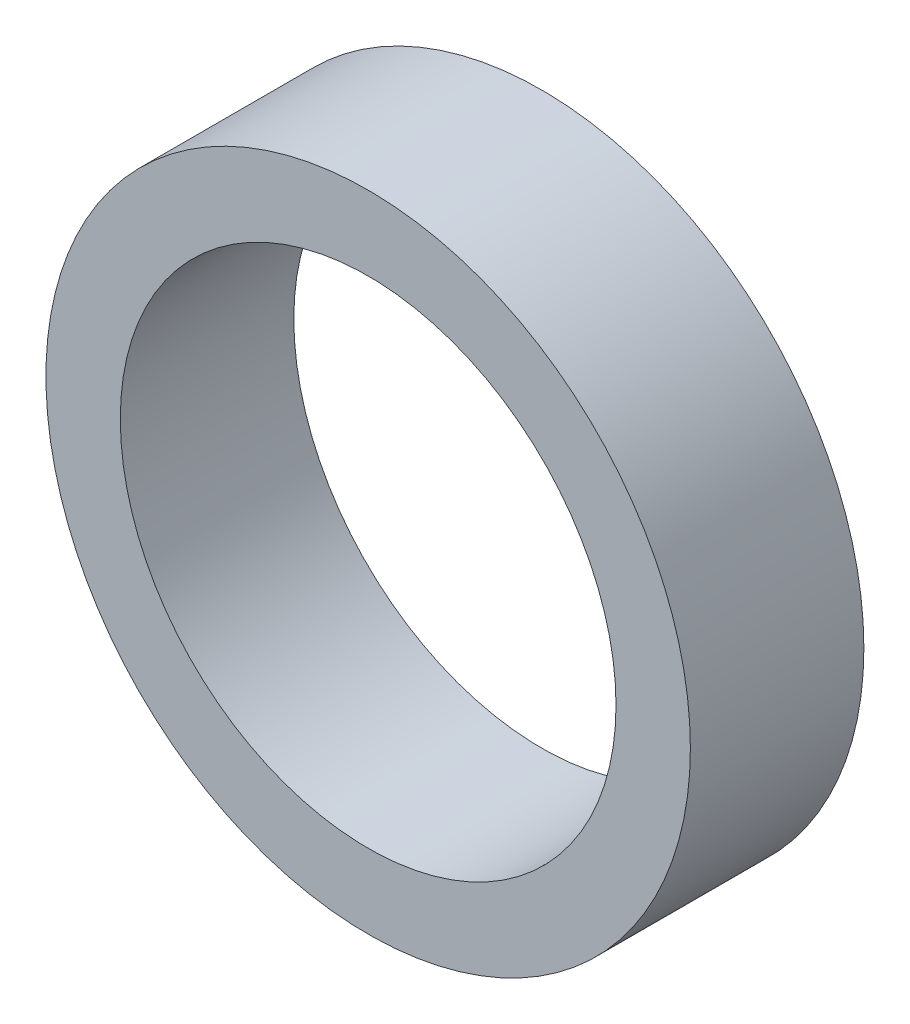
ISO-10303-21;
HEADER;
FILE_DESCRIPTION(('STEP AP214'),'2;1');
FILE_NAME('part.step','',(''),(''),'','','');
FILE_SCHEMA(('AUTOMOTIVE_DESIGN { 1 0 10303 214 1 1 1 1 }'));
ENDSEC;
DATA;
#1=APPLICATION_CONTEXT('core data for automotive mechanical design processes');
#2=APPLICATION_PROTOCOL_DEFINITION('international standard','automotive_design',2000,#1);
#3=PRODUCT_CONTEXT('',#1,'mechanical');
#4=PRODUCT('Part','Part','',(#3));
#5=PRODUCT_RELATED_PRODUCT_CATEGORY('part','',(#4));
#6=PRODUCT_DEFINITION_FORMATION('','',#4);
#7=PRODUCT_DEFINITION_CONTEXT('part definition',#1,'design');
#8=PRODUCT_DEFINITION('design','',#6,#7);
#9=PRODUCT_DEFINITION_SHAPE('','',#8);
#10=(LENGTH_UNIT() NAMED_UNIT(*) SI_UNIT(.MILLI.,.METRE.));
#11=(NAMED_UNIT(*) PLANE_ANGLE_UNIT() SI_UNIT($,.RADIAN.));
#12=(NAMED_UNIT(*) SI_UNIT($,.STERADIAN.) SOLID_ANGLE_UNIT());
#13=UNCERTAINTY_MEASURE_WITH_UNIT(LENGTH_MEASURE(1.E-05),#10,'distance_accuracy_value','');
#14=(GEOMETRIC_REPRESENTATION_CONTEXT(3) GLOBAL_UNCERTAINTY_ASSIGNED_CONTEXT((#13)) GLOBAL_UNIT_ASSIGNED_CONTEXT((#10,
#11,#12)) REPRESENTATION_CONTEXT('',''));
#15=CARTESIAN_POINT('',(0.,0.,0.));
#16=DIRECTION('',(0.,0.,1.));
#17=DIRECTION('',(1.,0.,0.));
#18=AXIS2_PLACEMENT_3D('',#15,#16,#17);
#19=CARTESIAN_POINT('',(0.,0.,3.5));
#20=DIRECTION('',(0.,0.,-1.));
#21=DIRECTION('',(-1.,0.,0.));
#22=AXIS2_PLACEMENT_3D('',#19,#20,#21);
#23=CYLINDRICAL_SURFACE('',#22,6.5);
#24=CARTESIAN_POINT('',(0.,0.,3.5));
#25=DIRECTION('',(0.,0.,1.));
#26=DIRECTION('',(1.,0.,0.));
#27=AXIS2_PLACEMENT_3D('',#24,#25,#26);
#28=CIRCLE('',#27,6.5);
#29=CARTESIAN_POINT('',(6.5,0.,3.5));
#30=VERTEX_POINT('',#29);
#31=EDGE_CURVE('E10',#30,#30,#28,.T.);
#32=ORIENTED_EDGE('',*,*,#31,.F.);
#33=EDGE_LOOP('',(#32));
#34=FACE_BOUND('',#33,.T.);
#35=CARTESIAN_POINT('',(0.,0.,0.));
#36=DIRECTION('',(0.,0.,1.));
#37=DIRECTION('',(1.,0.,0.));
#38=AXIS2_PLACEMENT_3D('',#35,#36,#37);
#39=CIRCLE('',#38,6.5);
#40=CARTESIAN_POINT('',(6.5,0.,0.));
#41=VERTEX_POINT('',#40);
#42=EDGE_CURVE('E36',#41,#41,#39,.T.);
#43=ORIENTED_EDGE('',*,*,#42,.T.);
#44=EDGE_LOOP('',(#43));
#45=FACE_BOUND('',#44,.T.);
#46=ADVANCED_FACE('F33',(#34,#45),#23,.T.);
#47=CARTESIAN_POINT('',(0.,0.,3.5));
#48=DIRECTION('',(0.,0.,1.));
#49=DIRECTION('',(1.,0.,0.));
#50=AXIS2_PLACEMENT_3D('',#47,#48,#49);
#51=PLANE('',#50);
#52=CARTESIAN_POINT('',(0.,0.,3.5));
#53=DIRECTION('',(0.,0.,1.));
#54=DIRECTION('',(1.,0.,0.));
#55=AXIS2_PLACEMENT_3D('',#52,#53,#54);
#56=CIRCLE('',#55,5.);
#57=CARTESIAN_POINT('',(5.,0.,3.5));
#58=VERTEX_POINT('',#57);
#59=EDGE_CURVE('E45',#58,#58,#56,.T.);
#60=ORIENTED_EDGE('',*,*,#59,.F.);
#61=EDGE_LOOP('',(#60));
#62=FACE_BOUND('',#61,.T.);
#63=ORIENTED_EDGE('',*,*,#31,.T.);
#64=EDGE_LOOP('',(#63));
#65=FACE_BOUND('',#64,.T.);
#66=ADVANCED_FACE('F60',(#62,#65),#51,.T.);
#67=CARTESIAN_POINT('',(0.,0.,0.));
#68=DIRECTION('',(0.,0.,1.));
#69=DIRECTION('',(1.,0.,0.));
#70=AXIS2_PLACEMENT_3D('',#67,#68,#69);
#71=PLANE('',#70);
#72=CARTESIAN_POINT('',(0.,0.,0.));
#73=DIRECTION('',(0.,0.,1.));
#74=DIRECTION('',(1.,0.,0.));
#75=AXIS2_PLACEMENT_3D('',#72,#73,#74);
#76=CIRCLE('',#75,5.);
#77=CARTESIAN_POINT('',(5.,0.,0.));
#78=VERTEX_POINT('',#77);
#79=EDGE_CURVE('E43',#78,#78,#76,.T.);
#80=ORIENTED_EDGE('',*,*,#79,.T.);
#81=EDGE_LOOP('',(#80));
#82=FACE_BOUND('',#81,.T.);
#83=ORIENTED_EDGE('',*,*,#42,.F.);
#84=EDGE_LOOP('',(#83));
#85=FACE_BOUND('',#84,.T.);
#86=ADVANCED_FACE('F51',(#82,#85),#71,.F.);
#87=CARTESIAN_POINT('',(0.,0.,0.));
#88=DIRECTION('',(0.,0.,1.));
#89=DIRECTION('',(1.,0.,0.));
#90=AXIS2_PLACEMENT_3D('',#87,#88,#89);
#91=CYLINDRICAL_SURFACE('',#90,5.);
#92=ORIENTED_EDGE('',*,*,#79,.F.);
#93=EDGE_LOOP('',(#92));
#94=FACE_BOUND('',#93,.T.);
#95=ORIENTED_EDGE('',*,*,#59,.T.);
#96=EDGE_LOOP('',(#95));
#97=FACE_BOUND('',#96,.T.);
#98=ADVANCED_FACE('F54',(#94,#97),#91,.F.);
#99=CLOSED_SHELL('',(#46,#66,#86,#98));
#100=MANIFOLD_SOLID_BREP('B2',#99);
#101=ADVANCED_BREP_SHAPE_REPRESENTATION('',(#18,#100),#14);
#102=SHAPE_DEFINITION_REPRESENTATION(#9,#101);
ENDSEC;
END-ISO-10303-21;
